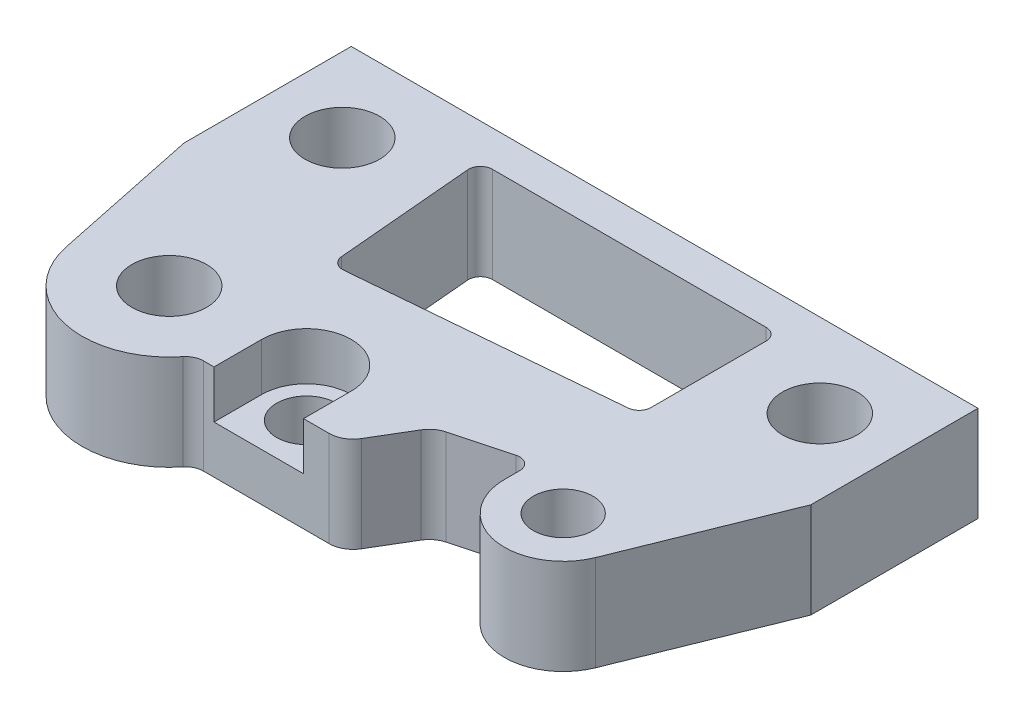
ISO-10303-21;
HEADER;
FILE_DESCRIPTION(('STEP AP214'),'2;1');
FILE_NAME('part.step','',(''),(''),'','','');
FILE_SCHEMA(('AUTOMOTIVE_DESIGN { 1 0 10303 214 1 1 1 1 }'));
ENDSEC;
DATA;
#1=APPLICATION_CONTEXT('core data for automotive mechanical design processes');
#2=APPLICATION_PROTOCOL_DEFINITION('international standard','automotive_design',2000,#1);
#3=PRODUCT_CONTEXT('',#1,'mechanical');
#4=PRODUCT('Part','Part','',(#3));
#5=PRODUCT_RELATED_PRODUCT_CATEGORY('part','',(#4));
#6=PRODUCT_DEFINITION_FORMATION('','',#4);
#7=PRODUCT_DEFINITION_CONTEXT('part definition',#1,'design');
#8=PRODUCT_DEFINITION('design','',#6,#7);
#9=PRODUCT_DEFINITION_SHAPE('','',#8);
#10=(LENGTH_UNIT() NAMED_UNIT(*) SI_UNIT(.MILLI.,.METRE.));
#11=(NAMED_UNIT(*) PLANE_ANGLE_UNIT() SI_UNIT($,.RADIAN.));
#12=(NAMED_UNIT(*) SI_UNIT($,.STERADIAN.) SOLID_ANGLE_UNIT());
#13=UNCERTAINTY_MEASURE_WITH_UNIT(LENGTH_MEASURE(1.E-05),#10,'distance_accuracy_value','');
#14=(GEOMETRIC_REPRESENTATION_CONTEXT(3) GLOBAL_UNCERTAINTY_ASSIGNED_CONTEXT((#13)) GLOBAL_UNIT_ASSIGNED_CONTEXT((#10,
#11,#12)) REPRESENTATION_CONTEXT('',''));
#15=CARTESIAN_POINT('',(0.,0.,0.));
#16=DIRECTION('',(0.,0.,1.));
#17=DIRECTION('',(1.,0.,0.));
#18=AXIS2_PLACEMENT_3D('',#15,#16,#17);
#19=CARTESIAN_POINT('',(14.605,10.16,0.));
#20=DIRECTION('',(0.,-1.,0.));
#21=DIRECTION('',(0.,0.,-1.));
#22=AXIS2_PLACEMENT_3D('',#19,#20,#21);
#23=CYLINDRICAL_SURFACE('',#22,3.175);
#24=DIRECTION('',(0.,-1.,0.));
#25=VECTOR('',#24,1.);
#26=CARTESIAN_POINT('',(15.5135625140549,10.16,-3.04222602021187));
#27=LINE('',#26,#25);
#28=CARTESIAN_POINT('',(15.5135625140549,5.08,-3.04222602021187));
#29=VERTEX_POINT('',#28);
#30=CARTESIAN_POINT('',(15.5135625140549,0.,-3.04222602021187));
#31=VERTEX_POINT('',#30);
#32=EDGE_CURVE('E370',#29,#31,#27,.T.);
#33=ORIENTED_EDGE('',*,*,#32,.F.);
#34=CARTESIAN_POINT('',(14.605,5.08,0.));
#35=DIRECTION('',(0.,1.,0.));
#36=DIRECTION('',(0.,0.,1.));
#37=AXIS2_PLACEMENT_3D('',#34,#35,#36);
#38=CIRCLE('',#37,3.175);
#39=CARTESIAN_POINT('',(17.7745040232334,5.08,0.186733089481817));
#40=VERTEX_POINT('',#39);
#41=EDGE_CURVE('E64',#29,#40,#38,.T.);
#42=ORIENTED_EDGE('',*,*,#41,.T.);
#43=DIRECTION('',(0.,-1.,0.));
#44=VECTOR('',#43,1.);
#45=CARTESIAN_POINT('',(17.7745040232334,10.16,0.186733089481817));
#46=LINE('',#45,#44);
#47=CARTESIAN_POINT('',(17.7745040232334,0.,0.186733089481817));
#48=VERTEX_POINT('',#47);
#49=EDGE_CURVE('E373',#40,#48,#46,.T.);
#50=ORIENTED_EDGE('',*,*,#49,.T.);
#51=CARTESIAN_POINT('',(14.605,0.,0.));
#52=DIRECTION('',(0.,1.,0.));
#53=DIRECTION('',(0.,0.,1.));
#54=AXIS2_PLACEMENT_3D('',#51,#52,#53);
#55=CIRCLE('',#54,3.175);
#56=EDGE_CURVE('E362',#31,#48,#55,.T.);
#57=ORIENTED_EDGE('',*,*,#56,.F.);
#58=EDGE_LOOP('',(#33,#42,#50,#57));
#59=FACE_BOUND('',#58,.T.);
#60=ADVANCED_FACE('F41',(#59),#23,.F.);
#61=CARTESIAN_POINT('',(17.7745040232334,10.16,0.186733089481817));
#62=DIRECTION('',(-0.819152044288991,0.,0.573576436351047));
#63=DIRECTION('',(0.573576436351047,0.,0.819152044288991));
#64=AXIS2_PLACEMENT_3D('',#61,#62,#63);
#65=PLANE('',#64);
#66=ORIENTED_EDGE('',*,*,#49,.F.);
#67=DIRECTION('',(-0.573576436351047,0.,-0.819152044288991));
#68=VECTOR('',#67,1.);
#69=CARTESIAN_POINT('',(17.7745040232334,5.08,0.186733089481817));
#70=LINE('',#69,#68);
#71=EDGE_CURVE('E11',#40,#29,#70,.T.);
#72=ORIENTED_EDGE('',*,*,#71,.T.);
#73=ORIENTED_EDGE('',*,*,#32,.T.);
#74=DIRECTION('',(-0.573576436351047,0.,-0.819152044288991));
#75=VECTOR('',#74,1.);
#76=CARTESIAN_POINT('',(17.7745040232334,0.,0.186733089481817));
#77=LINE('',#76,#75);
#78=EDGE_CURVE('E366',#48,#31,#77,.T.);
#79=ORIENTED_EDGE('',*,*,#78,.F.);
#80=EDGE_LOOP('',(#66,#72,#73,#79));
#81=FACE_BOUND('',#80,.T.);
#82=ADVANCED_FACE('F648',(#81),#65,.T.);
#83=CARTESIAN_POINT('',(41.91,10.16,0.));
#84=DIRECTION('',(0.,-1.,0.));
#85=DIRECTION('',(0.,0.,-1.));
#86=AXIS2_PLACEMENT_3D('',#83,#84,#85);
#87=PLANE('',#86);
#88=CARTESIAN_POINT('',(14.605,10.16,0.));
#89=DIRECTION('',(0.,1.,0.));
#90=DIRECTION('',(0.,0.,1.));
#91=AXIS2_PLACEMENT_3D('',#88,#89,#90);
#92=CIRCLE('',#91,4.7625);
#93=CARTESIAN_POINT('',(19.3675,10.16,0.));
#94=VERTEX_POINT('',#93);
#95=CARTESIAN_POINT('',(9.8425,10.16,0.));
#96=VERTEX_POINT('',#95);
#97=EDGE_CURVE('E238',#94,#96,#92,.T.);
#98=ORIENTED_EDGE('',*,*,#97,.F.);
#99=DIRECTION('',(0.,0.,-1.));
#100=VECTOR('',#99,1.);
#101=CARTESIAN_POINT('',(19.3675,10.16,0.));
#102=LINE('',#101,#100);
#103=CARTESIAN_POINT('',(19.3675,10.16,5.08));
#104=VERTEX_POINT('',#103);
#105=EDGE_CURVE('E254',#104,#94,#102,.T.);
#106=ORIENTED_EDGE('',*,*,#105,.F.);
#107=DIRECTION('',(1.,0.,0.));
#108=VECTOR('',#107,1.);
#109=CARTESIAN_POINT('',(8.72426220376256,10.16,5.08));
#110=LINE('',#109,#108);
#111=CARTESIAN_POINT('',(22.098,10.16,5.08));
#112=VERTEX_POINT('',#111);
#113=EDGE_CURVE('E435',#104,#112,#110,.T.);
#114=ORIENTED_EDGE('',*,*,#113,.T.);
#115=CARTESIAN_POINT('',(22.098,10.16,2.54));
#116=DIRECTION('',(0.,1.,0.));
#117=DIRECTION('',(0.,0.,1.));
#118=AXIS2_PLACEMENT_3D('',#115,#116,#117);
#119=CIRCLE('',#118,2.54);
#120=CARTESIAN_POINT('',(24.279366546391,10.16,3.84124555341646));
#121=VERTEX_POINT('',#120);
#122=EDGE_CURVE('E440',#112,#121,#119,.T.);
#123=ORIENTED_EDGE('',*,*,#122,.T.);
#124=DIRECTION('',(0.512301398982855,0.,-0.858805726925601));
#125=VECTOR('',#124,1.);
#126=CARTESIAN_POINT('',(26.647633453609,10.16,-0.12884156101521));
#127=LINE('',#126,#125);
#128=CARTESIAN_POINT('',(26.647633453609,10.16,-0.128841561015209));
#129=VERTEX_POINT('',#128);
#130=EDGE_CURVE('E443',#121,#129,#127,.T.);
#131=ORIENTED_EDGE('',*,*,#130,.T.);
#132=CARTESIAN_POINT('',(28.829,10.16,1.17240399240126));
#133=DIRECTION('',(0.,-1.,0.));
#134=DIRECTION('',(0.,0.,-1.));
#135=AXIS2_PLACEMENT_3D('',#132,#133,#134);
#136=CIRCLE('',#135,2.54);
#137=CARTESIAN_POINT('',(28.1745172141613,10.16,-1.28182751319085));
#138=VERTEX_POINT('',#137);
#139=EDGE_CURVE('E446',#129,#138,#136,.T.);
#140=ORIENTED_EDGE('',*,*,#139,.T.);
#141=DIRECTION('',(0.966232876217364,0.,-0.257670388125452));
#142=VECTOR('',#141,1.);
#143=CARTESIAN_POINT('',(34.0651586379278,10.16,-2.85271575279605));
#144=LINE('',#143,#142);
#145=CARTESIAN_POINT('',(34.0651586379278,10.16,-2.85271575279604));
#146=VERTEX_POINT('',#145);
#147=EDGE_CURVE('E449',#138,#146,#144,.T.);
#148=ORIENTED_EDGE('',*,*,#147,.T.);
#149=CARTESIAN_POINT('',(34.3924000308471,10.16,-1.62559999999997));
#150=DIRECTION('',(0.,-1.,0.));
#151=DIRECTION('',(0.,0.,-1.));
#152=AXIS2_PLACEMENT_3D('',#149,#150,#151);
#153=CIRCLE('',#152,1.27000000000001);
#154=CARTESIAN_POINT('',(35.6624000308471,10.16,-1.62559999999997));
#155=VERTEX_POINT('',#154);
#156=EDGE_CURVE('E452',#146,#155,#153,.T.);
#157=ORIENTED_EDGE('',*,*,#156,.T.);
#158=DIRECTION('',(0.,0.,1.));
#159=VECTOR('',#158,1.);
#160=CARTESIAN_POINT('',(35.6624000308471,10.16,0.));
#161=LINE('',#160,#159);
#162=CARTESIAN_POINT('',(35.6624000308471,10.16,0.));
#163=VERTEX_POINT('',#162);
#164=EDGE_CURVE('E455',#155,#163,#161,.T.);
#165=ORIENTED_EDGE('',*,*,#164,.T.);
#166=CARTESIAN_POINT('',(41.91,10.16,0.));
#167=DIRECTION('',(0.,1.,0.));
#168=DIRECTION('',(0.,0.,-1.));
#169=AXIS2_PLACEMENT_3D('',#166,#167,#168);
#170=CIRCLE('',#169,6.24759996915287);
#171=CARTESIAN_POINT('',(47.7026738211905,10.16,2.34039214146974));
#172=VERTEX_POINT('',#171);
#173=EDGE_CURVE('E409',#163,#172,#170,.T.);
#174=ORIENTED_EDGE('',*,*,#173,.T.);
#175=DIRECTION('',(0.374606593415917,0.,-0.927183854566786));
#176=VECTOR('',#175,1.);
#177=CARTESIAN_POINT('',(54.2925,10.16,-13.97));
#178=LINE('',#177,#176);
#179=CARTESIAN_POINT('',(54.2925,10.16,-13.97));
#180=VERTEX_POINT('',#179);
#181=EDGE_CURVE('E413',#172,#180,#178,.T.);
#182=ORIENTED_EDGE('',*,*,#181,.T.);
#183=DIRECTION('',(0.,0.,-1.));
#184=VECTOR('',#183,1.);
#185=CARTESIAN_POINT('',(54.2925,10.16,-13.97));
#186=LINE('',#185,#184);
#187=CARTESIAN_POINT('',(54.2925,10.16,-31.75));
#188=VERTEX_POINT('',#187);
#189=EDGE_CURVE('E417',#180,#188,#186,.T.);
#190=ORIENTED_EDGE('',*,*,#189,.T.);
#191=DIRECTION('',(-1.,0.,0.));
#192=VECTOR('',#191,1.);
#193=CARTESIAN_POINT('',(54.2925,10.16,-31.75));
#194=LINE('',#193,#192);
#195=CARTESIAN_POINT('',(-12.3825,10.16,-31.75));
#196=VERTEX_POINT('',#195);
#197=EDGE_CURVE('E420',#188,#196,#194,.T.);
#198=ORIENTED_EDGE('',*,*,#197,.T.);
#199=DIRECTION('',(0.,0.,1.));
#200=VECTOR('',#199,1.);
#201=CARTESIAN_POINT('',(-12.3825,10.16,-31.75));
#202=LINE('',#201,#200);
#203=CARTESIAN_POINT('',(-12.3825,10.16,-13.97));
#204=VERTEX_POINT('',#203);
#205=EDGE_CURVE('E423',#196,#204,#202,.T.);
#206=ORIENTED_EDGE('',*,*,#205,.T.);
#207=DIRECTION('',(0.204074136896406,0.,0.978955436498509));
#208=VECTOR('',#207,1.);
#209=CARTESIAN_POINT('',(-9.07589585177768,10.16,1.89197132316658));
#210=LINE('',#209,#208);
#211=CARTESIAN_POINT('',(-9.07589585177768,10.16,1.89197132316658));
#212=VERTEX_POINT('',#211);
#213=EDGE_CURVE('E426',#204,#212,#210,.T.);
#214=ORIENTED_EDGE('',*,*,#213,.T.);
#215=CARTESIAN_POINT('',(0.,10.16,0.));
#216=DIRECTION('',(0.,1.,0.));
#217=DIRECTION('',(0.,0.,-1.));
#218=AXIS2_PLACEMENT_3D('',#215,#216,#217);
#219=CIRCLE('',#218,9.271);
#220=CARTESIAN_POINT('',(7.23717205539394,10.16,5.794375));
#221=VERTEX_POINT('',#220);
#222=EDGE_CURVE('E429',#212,#221,#219,.T.);
#223=ORIENTED_EDGE('',*,*,#222,.T.);
#224=CARTESIAN_POINT('',(8.72426220376256,10.16,6.985));
#225=DIRECTION('',(0.,-1.,0.));
#226=DIRECTION('',(0.,0.,-1.));
#227=AXIS2_PLACEMENT_3D('',#224,#225,#226);
#228=CIRCLE('',#227,1.905);
#229=CARTESIAN_POINT('',(8.72426220376256,10.16,5.08));
#230=VERTEX_POINT('',#229);
#231=EDGE_CURVE('E432',#221,#230,#228,.T.);
#232=ORIENTED_EDGE('',*,*,#231,.T.);
#233=CARTESIAN_POINT('',(9.8425,10.16,5.08));
#234=VERTEX_POINT('',#233);
#235=EDGE_CURVE('E436',#230,#234,#110,.T.);
#236=ORIENTED_EDGE('',*,*,#235,.T.);
#237=DIRECTION('',(0.,0.,1.));
#238=VECTOR('',#237,1.);
#239=CARTESIAN_POINT('',(9.8425,10.16,5.08));
#240=LINE('',#239,#238);
#241=EDGE_CURVE('E258',#96,#234,#240,.T.);
#242=ORIENTED_EDGE('',*,*,#241,.F.);
#243=EDGE_LOOP('',(#98,#106,#114,#123,#131,#140,#148,#157,#165,#174,#182,#190,#198,#206,#214,
#223,#232,#236,#242));
#244=FACE_BOUND('',#243,.T.);
#245=CARTESIAN_POINT('',(0.,10.16,0.));
#246=DIRECTION('',(0.,1.,0.));
#247=DIRECTION('',(0.,0.,1.));
#248=AXIS2_PLACEMENT_3D('',#245,#246,#247);
#249=CIRCLE('',#248,3.96875);
#250=CARTESIAN_POINT('',(0.,10.16,3.96875));
#251=VERTEX_POINT('',#250);
#252=EDGE_CURVE('E401',#251,#251,#249,.T.);
#253=ORIENTED_EDGE('',*,*,#252,.F.);
#254=EDGE_LOOP('',(#253));
#255=FACE_BOUND('',#254,.T.);
#256=CARTESIAN_POINT('',(-4.445,10.16,-22.86));
#257=DIRECTION('',(0.,1.,0.));
#258=DIRECTION('',(0.,0.,1.));
#259=AXIS2_PLACEMENT_3D('',#256,#257,#258);
#260=CIRCLE('',#259,3.96875);
#261=CARTESIAN_POINT('',(-4.445,10.16,-18.89125));
#262=VERTEX_POINT('',#261);
#263=EDGE_CURVE('E393',#262,#262,#260,.T.);
#264=ORIENTED_EDGE('',*,*,#263,.F.);
#265=EDGE_LOOP('',(#264));
#266=FACE_BOUND('',#265,.T.);
#267=CARTESIAN_POINT('',(46.355,10.16,-22.86));
#268=DIRECTION('',(0.,1.,0.));
#269=DIRECTION('',(0.,0.,1.));
#270=AXIS2_PLACEMENT_3D('',#267,#268,#269);
#271=CIRCLE('',#270,3.96875);
#272=CARTESIAN_POINT('',(46.355,10.16,-18.89125));
#273=VERTEX_POINT('',#272);
#274=EDGE_CURVE('E385',#273,#273,#271,.T.);
#275=ORIENTED_EDGE('',*,*,#274,.F.);
#276=EDGE_LOOP('',(#275));
#277=FACE_BOUND('',#276,.T.);
#278=CARTESIAN_POINT('',(41.91,10.16,0.));
#279=DIRECTION('',(0.,1.,0.));
#280=DIRECTION('',(0.,0.,1.));
#281=AXIS2_PLACEMENT_3D('',#278,#279,#280);
#282=CIRCLE('',#281,3.175);
#283=CARTESIAN_POINT('',(41.91,10.16,3.175));
#284=VERTEX_POINT('',#283);
#285=EDGE_CURVE('E377',#284,#284,#282,.T.);
#286=ORIENTED_EDGE('',*,*,#285,.F.);
#287=EDGE_LOOP('',(#286));
#288=FACE_BOUND('',#287,.T.);
#289=CARTESIAN_POINT('',(7.72632013531664,10.16,-11.9940597077124));
#290=DIRECTION('',(0.,1.,0.));
#291=DIRECTION('',(0.,0.,1.));
#292=AXIS2_PLACEMENT_3D('',#289,#290,#291);
#293=CIRCLE('',#292,1.27);
#294=CARTESIAN_POINT('',(6.46115286874012,10.16,-11.8833719144229));
#295=VERTEX_POINT('',#294);
#296=CARTESIAN_POINT('',(7.83700792860617,10.16,-10.7288924411359));
#297=VERTEX_POINT('',#296);
#298=EDGE_CURVE('E280',#295,#297,#293,.T.);
#299=ORIENTED_EDGE('',*,*,#298,.F.);
#300=DIRECTION('',(0.087155742747662,0.,0.996194698091745));
#301=VECTOR('',#300,1.);
#302=CARTESIAN_POINT('',(5.17717446658157,10.16,-26.5593122067105));
#303=LINE('',#302,#301);
#304=CARTESIAN_POINT('',(5.17717446658156,10.16,-26.5593122067105));
#305=VERTEX_POINT('',#304);
#306=EDGE_CURVE('E303',#305,#295,#303,.T.);
#307=ORIENTED_EDGE('',*,*,#306,.F.);
#308=CARTESIAN_POINT('',(6.44234173315808,10.16,-26.67));
#309=DIRECTION('',(0.,1.,0.));
#310=DIRECTION('',(0.,0.,-1.));
#311=AXIS2_PLACEMENT_3D('',#308,#309,#310);
#312=CIRCLE('',#311,1.27);
#313=CARTESIAN_POINT('',(6.44234173315808,10.16,-27.94));
#314=VERTEX_POINT('',#313);
#315=EDGE_CURVE('E299',#314,#305,#312,.T.);
#316=ORIENTED_EDGE('',*,*,#315,.F.);
#317=DIRECTION('',(-1.,0.,0.));
#318=VECTOR('',#317,1.);
#319=CARTESIAN_POINT('',(35.56,10.16,-27.94));
#320=LINE('',#319,#318);
#321=CARTESIAN_POINT('',(35.56,10.16,-27.94));
#322=VERTEX_POINT('',#321);
#323=EDGE_CURVE('E296',#322,#314,#320,.T.);
#324=ORIENTED_EDGE('',*,*,#323,.F.);
#325=CARTESIAN_POINT('',(35.56,10.16,-26.67));
#326=DIRECTION('',(0.,1.,0.));
#327=DIRECTION('',(0.,0.,-1.));
#328=AXIS2_PLACEMENT_3D('',#325,#326,#327);
#329=CIRCLE('',#328,1.27);
#330=CARTESIAN_POINT('',(36.83,10.16,-26.67));
#331=VERTEX_POINT('',#330);
#332=EDGE_CURVE('E293',#331,#322,#329,.T.);
#333=ORIENTED_EDGE('',*,*,#332,.F.);
#334=DIRECTION('',(0.,0.,-1.));
#335=VECTOR('',#334,1.);
#336=CARTESIAN_POINT('',(36.83,10.16,-14.4291911600822));
#337=LINE('',#336,#335);
#338=CARTESIAN_POINT('',(36.83,10.16,-14.4291911600822));
#339=VERTEX_POINT('',#338);
#340=EDGE_CURVE('E290',#339,#331,#337,.T.);
#341=ORIENTED_EDGE('',*,*,#340,.F.);
#342=CARTESIAN_POINT('',(35.56,10.16,-14.4291911600822));
#343=DIRECTION('',(0.,1.,0.));
#344=DIRECTION('',(0.,0.,1.));
#345=AXIS2_PLACEMENT_3D('',#342,#343,#344);
#346=CIRCLE('',#345,1.27);
#347=CARTESIAN_POINT('',(35.6706877932895,10.16,-13.1640238935057));
#348=VERTEX_POINT('',#347);
#349=EDGE_CURVE('E287',#348,#339,#346,.T.);
#350=ORIENTED_EDGE('',*,*,#349,.F.);
#351=DIRECTION('',(0.996194698091745,0.,-0.0871557427476655));
#352=VECTOR('',#351,1.);
#353=CARTESIAN_POINT('',(7.83700792860617,10.16,-10.7288924411359));
#354=LINE('',#353,#352);
#355=EDGE_CURVE('E283',#297,#348,#354,.T.);
#356=ORIENTED_EDGE('',*,*,#355,.F.);
#357=EDGE_LOOP('',(#299,#307,#316,#324,#333,#341,#350,#356));
#358=FACE_BOUND('',#357,.T.);
#359=ADVANCED_FACE('F585',(#244,#255,#266,#277,#288,#358),#87,.F.);
#360=CARTESIAN_POINT('',(41.91,0.,0.));
#361=DIRECTION('',(0.,-1.,0.));
#362=DIRECTION('',(0.,0.,-1.));
#363=AXIS2_PLACEMENT_3D('',#360,#361,#362);
#364=PLANE('',#363);
#365=CARTESIAN_POINT('',(46.355,0.,-22.86));
#366=DIRECTION('',(0.,1.,0.));
#367=DIRECTION('',(0.,0.,1.));
#368=AXIS2_PLACEMENT_3D('',#365,#366,#367);
#369=CIRCLE('',#368,3.96875);
#370=CARTESIAN_POINT('',(46.355,0.,-18.89125));
#371=VERTEX_POINT('',#370);
#372=EDGE_CURVE('E381',#371,#371,#369,.T.);
#373=ORIENTED_EDGE('',*,*,#372,.T.);
#374=EDGE_LOOP('',(#373));
#375=FACE_BOUND('',#374,.T.);
#376=CARTESIAN_POINT('',(0.,0.,0.));
#377=DIRECTION('',(0.,1.,0.));
#378=DIRECTION('',(0.,0.,1.));
#379=AXIS2_PLACEMENT_3D('',#376,#377,#378);
#380=CIRCLE('',#379,3.96875);
#381=CARTESIAN_POINT('',(0.,0.,3.96875));
#382=VERTEX_POINT('',#381);
#383=EDGE_CURVE('E397',#382,#382,#380,.T.);
#384=ORIENTED_EDGE('',*,*,#383,.T.);
#385=EDGE_LOOP('',(#384));
#386=FACE_BOUND('',#385,.T.);
#387=CARTESIAN_POINT('',(41.91,0.,0.));
#388=DIRECTION('',(0.,1.,0.));
#389=DIRECTION('',(0.,0.,-1.));
#390=AXIS2_PLACEMENT_3D('',#387,#388,#389);
#391=CIRCLE('',#390,6.24759996915287);
#392=CARTESIAN_POINT('',(35.6624000308471,0.,0.));
#393=VERTEX_POINT('',#392);
#394=CARTESIAN_POINT('',(47.7026738211905,0.,2.34039214146974));
#395=VERTEX_POINT('',#394);
#396=EDGE_CURVE('E405',#393,#395,#391,.T.);
#397=ORIENTED_EDGE('',*,*,#396,.F.);
#398=DIRECTION('',(0.,0.,1.));
#399=VECTOR('',#398,1.);
#400=CARTESIAN_POINT('',(35.6624000308471,0.,0.));
#401=LINE('',#400,#399);
#402=CARTESIAN_POINT('',(35.6624000308471,0.,-1.62559999999997));
#403=VERTEX_POINT('',#402);
#404=EDGE_CURVE('E414',#403,#393,#401,.T.);
#405=ORIENTED_EDGE('',*,*,#404,.F.);
#406=CARTESIAN_POINT('',(34.3924000308471,0.,-1.62559999999997));
#407=DIRECTION('',(0.,-1.,0.));
#408=DIRECTION('',(0.,0.,-1.));
#409=AXIS2_PLACEMENT_3D('',#406,#407,#408);
#410=CIRCLE('',#409,1.27000000000001);
#411=CARTESIAN_POINT('',(34.0651586379278,0.,-2.85271575279604));
#412=VERTEX_POINT('',#411);
#413=EDGE_CURVE('E498',#412,#403,#410,.T.);
#414=ORIENTED_EDGE('',*,*,#413,.F.);
#415=DIRECTION('',(0.966232876217364,0.,-0.257670388125452));
#416=VECTOR('',#415,1.);
#417=CARTESIAN_POINT('',(34.0651586379278,0.,-2.85271575279605));
#418=LINE('',#417,#416);
#419=CARTESIAN_POINT('',(28.1745172141613,0.,-1.28182751319085));
#420=VERTEX_POINT('',#419);
#421=EDGE_CURVE('E495',#420,#412,#418,.T.);
#422=ORIENTED_EDGE('',*,*,#421,.F.);
#423=CARTESIAN_POINT('',(28.829,0.,1.17240399240126));
#424=DIRECTION('',(0.,-1.,0.));
#425=DIRECTION('',(0.,0.,-1.));
#426=AXIS2_PLACEMENT_3D('',#423,#424,#425);
#427=CIRCLE('',#426,2.54);
#428=CARTESIAN_POINT('',(26.647633453609,0.,-0.128841561015209));
#429=VERTEX_POINT('',#428);
#430=EDGE_CURVE('E492',#429,#420,#427,.T.);
#431=ORIENTED_EDGE('',*,*,#430,.F.);
#432=DIRECTION('',(0.512301398982855,0.,-0.858805726925601));
#433=VECTOR('',#432,1.);
#434=CARTESIAN_POINT('',(26.647633453609,0.,-0.12884156101521));
#435=LINE('',#434,#433);
#436=CARTESIAN_POINT('',(24.279366546391,0.,3.84124555341646));
#437=VERTEX_POINT('',#436);
#438=EDGE_CURVE('E489',#437,#429,#435,.T.);
#439=ORIENTED_EDGE('',*,*,#438,.F.);
#440=CARTESIAN_POINT('',(22.098,0.,2.54));
#441=DIRECTION('',(0.,1.,0.));
#442=DIRECTION('',(0.,0.,1.));
#443=AXIS2_PLACEMENT_3D('',#440,#441,#442);
#444=CIRCLE('',#443,2.54);
#445=CARTESIAN_POINT('',(22.098,0.,5.08));
#446=VERTEX_POINT('',#445);
#447=EDGE_CURVE('E486',#446,#437,#444,.T.);
#448=ORIENTED_EDGE('',*,*,#447,.F.);
#449=DIRECTION('',(1.,0.,0.));
#450=VECTOR('',#449,1.);
#451=CARTESIAN_POINT('',(8.72426220376256,0.,5.08));
#452=LINE('',#451,#450);
#453=CARTESIAN_POINT('',(8.72426220376256,0.,5.08));
#454=VERTEX_POINT('',#453);
#455=EDGE_CURVE('E483',#454,#446,#452,.T.);
#456=ORIENTED_EDGE('',*,*,#455,.F.);
#457=CARTESIAN_POINT('',(8.72426220376256,0.,6.985));
#458=DIRECTION('',(0.,-1.,0.));
#459=DIRECTION('',(0.,0.,-1.));
#460=AXIS2_PLACEMENT_3D('',#457,#458,#459);
#461=CIRCLE('',#460,1.905);
#462=CARTESIAN_POINT('',(7.23717205539394,0.,5.794375));
#463=VERTEX_POINT('',#462);
#464=EDGE_CURVE('E480',#463,#454,#461,.T.);
#465=ORIENTED_EDGE('',*,*,#464,.F.);
#466=CARTESIAN_POINT('',(0.,0.,0.));
#467=DIRECTION('',(0.,1.,0.));
#468=DIRECTION('',(0.,0.,-1.));
#469=AXIS2_PLACEMENT_3D('',#466,#467,#468);
#470=CIRCLE('',#469,9.271);
#471=CARTESIAN_POINT('',(-9.07589585177768,0.,1.89197132316658));
#472=VERTEX_POINT('',#471);
#473=EDGE_CURVE('E477',#472,#463,#470,.T.);
#474=ORIENTED_EDGE('',*,*,#473,.F.);
#475=DIRECTION('',(0.204074136896406,0.,0.978955436498509));
#476=VECTOR('',#475,1.);
#477=CARTESIAN_POINT('',(-9.07589585177768,0.,1.89197132316658));
#478=LINE('',#477,#476);
#479=CARTESIAN_POINT('',(-12.3825,0.,-13.97));
#480=VERTEX_POINT('',#479);
#481=EDGE_CURVE('E474',#480,#472,#478,.T.);
#482=ORIENTED_EDGE('',*,*,#481,.F.);
#483=DIRECTION('',(0.,0.,1.));
#484=VECTOR('',#483,1.);
#485=CARTESIAN_POINT('',(-12.3825,0.,-31.75));
#486=LINE('',#485,#484);
#487=CARTESIAN_POINT('',(-12.3825,0.,-31.75));
#488=VERTEX_POINT('',#487);
#489=EDGE_CURVE('E471',#488,#480,#486,.T.);
#490=ORIENTED_EDGE('',*,*,#489,.F.);
#491=DIRECTION('',(-1.,0.,0.));
#492=VECTOR('',#491,1.);
#493=CARTESIAN_POINT('',(54.2925,0.,-31.75));
#494=LINE('',#493,#492);
#495=CARTESIAN_POINT('',(54.2925,0.,-31.75));
#496=VERTEX_POINT('',#495);
#497=EDGE_CURVE('E468',#496,#488,#494,.T.);
#498=ORIENTED_EDGE('',*,*,#497,.F.);
#499=DIRECTION('',(0.,0.,-1.));
#500=VECTOR('',#499,1.);
#501=CARTESIAN_POINT('',(54.2925,0.,-13.97));
#502=LINE('',#501,#500);
#503=CARTESIAN_POINT('',(54.2925,0.,-13.97));
#504=VERTEX_POINT('',#503);
#505=EDGE_CURVE('E465',#504,#496,#502,.T.);
#506=ORIENTED_EDGE('',*,*,#505,.F.);
#507=DIRECTION('',(0.374606593415917,0.,-0.927183854566786));
#508=VECTOR('',#507,1.);
#509=CARTESIAN_POINT('',(54.2925,0.,-13.97));
#510=LINE('',#509,#508);
#511=EDGE_CURVE('E462',#395,#504,#510,.T.);
#512=ORIENTED_EDGE('',*,*,#511,.F.);
#513=EDGE_LOOP('',(#397,#405,#414,#422,#431,#439,#448,#456,#465,#474,#482,#490,#498,#506,#512));
#514=FACE_BOUND('',#513,.T.);
#515=CARTESIAN_POINT('',(-4.445,0.,-22.86));
#516=DIRECTION('',(0.,1.,0.));
#517=DIRECTION('',(0.,0.,1.));
#518=AXIS2_PLACEMENT_3D('',#515,#516,#517);
#519=CIRCLE('',#518,3.96875);
#520=CARTESIAN_POINT('',(-4.445,0.,-18.89125));
#521=VERTEX_POINT('',#520);
#522=EDGE_CURVE('E389',#521,#521,#519,.T.);
#523=ORIENTED_EDGE('',*,*,#522,.T.);
#524=EDGE_LOOP('',(#523));
#525=FACE_BOUND('',#524,.T.);
#526=CARTESIAN_POINT('',(41.91,0.,0.));
#527=DIRECTION('',(0.,1.,0.));
#528=DIRECTION('',(0.,0.,1.));
#529=AXIS2_PLACEMENT_3D('',#526,#527,#528);
#530=CIRCLE('',#529,3.175);
#531=CARTESIAN_POINT('',(41.91,0.,3.175));
#532=VERTEX_POINT('',#531);
#533=EDGE_CURVE('E376',#532,#532,#530,.T.);
#534=ORIENTED_EDGE('',*,*,#533,.T.);
#535=EDGE_LOOP('',(#534));
#536=FACE_BOUND('',#535,.T.);
#537=ORIENTED_EDGE('',*,*,#78,.T.);
#538=ORIENTED_EDGE('',*,*,#56,.T.);
#539=EDGE_LOOP('',(#537,#538));
#540=FACE_BOUND('',#539,.T.);
#541=DIRECTION('',(0.087155742747662,0.,0.996194698091745));
#542=VECTOR('',#541,1.);
#543=CARTESIAN_POINT('',(5.17717446658157,0.,-26.5593122067105));
#544=LINE('',#543,#542);
#545=CARTESIAN_POINT('',(5.17717446658157,0.,-26.5593122067105));
#546=VERTEX_POINT('',#545);
#547=CARTESIAN_POINT('',(6.46115286874011,0.,-11.8833719144229));
#548=VERTEX_POINT('',#547);
#549=EDGE_CURVE('E284',#546,#548,#544,.T.);
#550=ORIENTED_EDGE('',*,*,#549,.T.);
#551=CARTESIAN_POINT('',(7.72632013531664,0.,-11.9940597077124));
#552=DIRECTION('',(0.,1.,0.));
#553=DIRECTION('',(0.,0.,1.));
#554=AXIS2_PLACEMENT_3D('',#551,#552,#553);
#555=CIRCLE('',#554,1.27);
#556=CARTESIAN_POINT('',(7.83700792860617,0.,-10.7288924411359));
#557=VERTEX_POINT('',#556);
#558=EDGE_CURVE('E279',#548,#557,#555,.T.);
#559=ORIENTED_EDGE('',*,*,#558,.T.);
#560=DIRECTION('',(0.996194698091745,0.,-0.0871557427476655));
#561=VECTOR('',#560,1.);
#562=CARTESIAN_POINT('',(7.83700792860617,0.,-10.7288924411359));
#563=LINE('',#562,#561);
#564=CARTESIAN_POINT('',(35.6706877932895,0.,-13.1640238935057));
#565=VERTEX_POINT('',#564);
#566=EDGE_CURVE('E310',#557,#565,#563,.T.);
#567=ORIENTED_EDGE('',*,*,#566,.T.);
#568=CARTESIAN_POINT('',(35.56,0.,-14.4291911600822));
#569=DIRECTION('',(0.,1.,0.));
#570=DIRECTION('',(0.,0.,1.));
#571=AXIS2_PLACEMENT_3D('',#568,#569,#570);
#572=CIRCLE('',#571,1.27);
#573=CARTESIAN_POINT('',(36.83,0.,-14.4291911600822));
#574=VERTEX_POINT('',#573);
#575=EDGE_CURVE('E314',#565,#574,#572,.T.);
#576=ORIENTED_EDGE('',*,*,#575,.T.);
#577=DIRECTION('',(0.,0.,-1.));
#578=VECTOR('',#577,1.);
#579=CARTESIAN_POINT('',(36.83,0.,-14.4291911600822));
#580=LINE('',#579,#578);
#581=CARTESIAN_POINT('',(36.83,0.,-26.67));
#582=VERTEX_POINT('',#581);
#583=EDGE_CURVE('E318',#574,#582,#580,.T.);
#584=ORIENTED_EDGE('',*,*,#583,.T.);
#585=CARTESIAN_POINT('',(35.56,0.,-26.67));
#586=DIRECTION('',(0.,1.,0.));
#587=DIRECTION('',(0.,0.,-1.));
#588=AXIS2_PLACEMENT_3D('',#585,#586,#587);
#589=CIRCLE('',#588,1.27);
#590=CARTESIAN_POINT('',(35.56,0.,-27.94));
#591=VERTEX_POINT('',#590);
#592=EDGE_CURVE('E322',#582,#591,#589,.T.);
#593=ORIENTED_EDGE('',*,*,#592,.T.);
#594=DIRECTION('',(-1.,0.,0.));
#595=VECTOR('',#594,1.);
#596=CARTESIAN_POINT('',(35.56,0.,-27.94));
#597=LINE('',#596,#595);
#598=CARTESIAN_POINT('',(6.44234173315808,0.,-27.94));
#599=VERTEX_POINT('',#598);
#600=EDGE_CURVE('E326',#591,#599,#597,.T.);
#601=ORIENTED_EDGE('',*,*,#600,.T.);
#602=CARTESIAN_POINT('',(6.44234173315808,0.,-26.67));
#603=DIRECTION('',(0.,1.,0.));
#604=DIRECTION('',(0.,0.,-1.));
#605=AXIS2_PLACEMENT_3D('',#602,#603,#604);
#606=CIRCLE('',#605,1.27);
#607=EDGE_CURVE('E330',#599,#546,#606,.T.);
#608=ORIENTED_EDGE('',*,*,#607,.T.);
#609=EDGE_LOOP('',(#550,#559,#567,#576,#584,#593,#601,#608));
#610=FACE_BOUND('',#609,.T.);
#611=ADVANCED_FACE('F569',(#375,#386,#514,#525,#536,#540,#610),#364,.T.);
#612=CARTESIAN_POINT('',(41.91,10.16,0.));
#613=DIRECTION('',(0.,-1.,0.));
#614=DIRECTION('',(0.,0.,-1.));
#615=AXIS2_PLACEMENT_3D('',#612,#613,#614);
#616=CYLINDRICAL_SURFACE('',#615,6.24759996915287);
#617=ORIENTED_EDGE('',*,*,#396,.T.);
#618=DIRECTION('',(0.,-1.,0.));
#619=VECTOR('',#618,1.);
#620=CARTESIAN_POINT('',(47.7026738211905,10.16,2.34039214146974));
#621=LINE('',#620,#619);
#622=EDGE_CURVE('E50',#172,#395,#621,.T.);
#623=ORIENTED_EDGE('',*,*,#622,.F.);
#624=ORIENTED_EDGE('',*,*,#173,.F.);
#625=DIRECTION('',(0.,-1.,0.));
#626=VECTOR('',#625,1.);
#627=CARTESIAN_POINT('',(35.6624000308471,10.16,0.));
#628=LINE('',#627,#626);
#629=EDGE_CURVE('E458',#163,#393,#628,.T.);
#630=ORIENTED_EDGE('',*,*,#629,.T.);
#631=EDGE_LOOP('',(#617,#623,#624,#630));
#632=FACE_BOUND('',#631,.T.);
#633=ADVANCED_FACE('F43',(#632),#616,.T.);
#634=CARTESIAN_POINT('',(54.2925,10.16,-13.97));
#635=DIRECTION('',(-0.927183854566786,0.,-0.374606593415917));
#636=DIRECTION('',(-0.374606593415917,0.,0.927183854566786));
#637=AXIS2_PLACEMENT_3D('',#634,#635,#636);
#638=PLANE('',#637);
#639=ORIENTED_EDGE('',*,*,#511,.T.);
#640=DIRECTION('',(0.,-1.,0.));
#641=VECTOR('',#640,1.);
#642=CARTESIAN_POINT('',(54.2925,10.16,-13.97));
#643=LINE('',#642,#641);
#644=EDGE_CURVE('E554',#180,#504,#643,.T.);
#645=ORIENTED_EDGE('',*,*,#644,.F.);
#646=ORIENTED_EDGE('',*,*,#181,.F.);
#647=ORIENTED_EDGE('',*,*,#622,.T.);
#648=EDGE_LOOP('',(#639,#645,#646,#647));
#649=FACE_BOUND('',#648,.T.);
#650=ADVANCED_FACE('F561',(#649),#638,.F.);
#651=CARTESIAN_POINT('',(54.2925,10.16,-13.97));
#652=DIRECTION('',(-1.,0.,0.));
#653=DIRECTION('',(0.,0.,1.));
#654=AXIS2_PLACEMENT_3D('',#651,#652,#653);
#655=PLANE('',#654);
#656=ORIENTED_EDGE('',*,*,#505,.T.);
#657=DIRECTION('',(0.,-1.,0.));
#658=VECTOR('',#657,1.);
#659=CARTESIAN_POINT('',(54.2925,10.16,-31.75));
#660=LINE('',#659,#658);
#661=EDGE_CURVE('E550',#188,#496,#660,.T.);
#662=ORIENTED_EDGE('',*,*,#661,.F.);
#663=ORIENTED_EDGE('',*,*,#189,.F.);
#664=ORIENTED_EDGE('',*,*,#644,.T.);
#665=EDGE_LOOP('',(#656,#662,#663,#664));
#666=FACE_BOUND('',#665,.T.);
#667=ADVANCED_FACE('F577',(#666),#655,.F.);
#668=CARTESIAN_POINT('',(54.2925,10.16,-31.75));
#669=DIRECTION('',(0.,0.,1.));
#670=DIRECTION('',(1.,0.,0.));
#671=AXIS2_PLACEMENT_3D('',#668,#669,#670);
#672=PLANE('',#671);
#673=ORIENTED_EDGE('',*,*,#497,.T.);
#674=DIRECTION('',(0.,-1.,0.));
#675=VECTOR('',#674,1.);
#676=CARTESIAN_POINT('',(-12.3825,10.16,-31.75));
#677=LINE('',#676,#675);
#678=EDGE_CURVE('E546',#196,#488,#677,.T.);
#679=ORIENTED_EDGE('',*,*,#678,.F.);
#680=ORIENTED_EDGE('',*,*,#197,.F.);
#681=ORIENTED_EDGE('',*,*,#661,.T.);
#682=EDGE_LOOP('',(#673,#679,#680,#681));
#683=FACE_BOUND('',#682,.T.);
#684=ADVANCED_FACE('F581',(#683),#672,.F.);
#685=CARTESIAN_POINT('',(-12.3825,10.16,-31.75));
#686=DIRECTION('',(1.,0.,0.));
#687=DIRECTION('',(0.,0.,-1.));
#688=AXIS2_PLACEMENT_3D('',#685,#686,#687);
#689=PLANE('',#688);
#690=ORIENTED_EDGE('',*,*,#489,.T.);
#691=DIRECTION('',(0.,-1.,0.));
#692=VECTOR('',#691,1.);
#693=CARTESIAN_POINT('',(-12.3825,10.16,-13.97));
#694=LINE('',#693,#692);
#695=EDGE_CURVE('E542',#204,#480,#694,.T.);
#696=ORIENTED_EDGE('',*,*,#695,.F.);
#697=ORIENTED_EDGE('',*,*,#205,.F.);
#698=ORIENTED_EDGE('',*,*,#678,.T.);
#699=EDGE_LOOP('',(#690,#696,#697,#698));
#700=FACE_BOUND('',#699,.T.);
#701=ADVANCED_FACE('F638',(#700),#689,.F.);
#702=CARTESIAN_POINT('',(-9.07589585177768,10.16,1.89197132316658));
#703=DIRECTION('',(0.978955436498509,0.,-0.204074136896406));
#704=DIRECTION('',(-0.204074136896406,0.,-0.97895543649851));
#705=AXIS2_PLACEMENT_3D('',#702,#703,#704);
#706=PLANE('',#705);
#707=ORIENTED_EDGE('',*,*,#481,.T.);
#708=DIRECTION('',(0.,-1.,0.));
#709=VECTOR('',#708,1.);
#710=CARTESIAN_POINT('',(-9.07589585177768,10.16,1.89197132316658));
#711=LINE('',#710,#709);
#712=EDGE_CURVE('E538',#212,#472,#711,.T.);
#713=ORIENTED_EDGE('',*,*,#712,.F.);
#714=ORIENTED_EDGE('',*,*,#213,.F.);
#715=ORIENTED_EDGE('',*,*,#695,.T.);
#716=EDGE_LOOP('',(#707,#713,#714,#715));
#717=FACE_BOUND('',#716,.T.);
#718=ADVANCED_FACE('F636',(#717),#706,.F.);
#719=CARTESIAN_POINT('',(0.,10.16,0.));
#720=DIRECTION('',(0.,-1.,0.));
#721=DIRECTION('',(0.,0.,-1.));
#722=AXIS2_PLACEMENT_3D('',#719,#720,#721);
#723=CYLINDRICAL_SURFACE('',#722,9.271);
#724=ORIENTED_EDGE('',*,*,#473,.T.);
#725=DIRECTION('',(0.,-1.,0.));
#726=VECTOR('',#725,1.);
#727=CARTESIAN_POINT('',(7.23717205539394,10.16,5.794375));
#728=LINE('',#727,#726);
#729=EDGE_CURVE('E534',#221,#463,#728,.T.);
#730=ORIENTED_EDGE('',*,*,#729,.F.);
#731=ORIENTED_EDGE('',*,*,#222,.F.);
#732=ORIENTED_EDGE('',*,*,#712,.T.);
#733=EDGE_LOOP('',(#724,#730,#731,#732));
#734=FACE_BOUND('',#733,.T.);
#735=ADVANCED_FACE('F631',(#734),#723,.T.);
#736=CARTESIAN_POINT('',(8.72426220376256,10.16,6.985));
#737=DIRECTION('',(0.,-1.,0.));
#738=DIRECTION('',(0.,0.,-1.));
#739=AXIS2_PLACEMENT_3D('',#736,#737,#738);
#740=CYLINDRICAL_SURFACE('',#739,1.905);
#741=ORIENTED_EDGE('',*,*,#464,.T.);
#742=DIRECTION('',(0.,-1.,0.));
#743=VECTOR('',#742,1.);
#744=CARTESIAN_POINT('',(8.72426220376256,10.16,5.08));
#745=LINE('',#744,#743);
#746=EDGE_CURVE('E530',#230,#454,#745,.T.);
#747=ORIENTED_EDGE('',*,*,#746,.F.);
#748=ORIENTED_EDGE('',*,*,#231,.F.);
#749=ORIENTED_EDGE('',*,*,#729,.T.);
#750=EDGE_LOOP('',(#741,#747,#748,#749));
#751=FACE_BOUND('',#750,.T.);
#752=ADVANCED_FACE('F626',(#751),#740,.F.);
#753=CARTESIAN_POINT('',(8.72426220376256,10.16,5.08));
#754=DIRECTION('',(0.,0.,-1.));
#755=DIRECTION('',(-1.,0.,0.));
#756=AXIS2_PLACEMENT_3D('',#753,#754,#755);
#757=PLANE('',#756);
#758=ORIENTED_EDGE('',*,*,#113,.F.);
#759=DIRECTION('',(0.,1.,0.));
#760=VECTOR('',#759,1.);
#761=CARTESIAN_POINT('',(19.3675,5.08,5.08));
#762=LINE('',#761,#760);
#763=CARTESIAN_POINT('',(19.3675,5.08,5.08));
#764=VERTEX_POINT('',#763);
#765=EDGE_CURVE('E272',#764,#104,#762,.T.);
#766=ORIENTED_EDGE('',*,*,#765,.F.);
#767=DIRECTION('',(1.,0.,0.));
#768=VECTOR('',#767,1.);
#769=CARTESIAN_POINT('',(19.3675,5.08,5.08));
#770=LINE('',#769,#768);
#771=CARTESIAN_POINT('',(9.8425,5.08,5.08));
#772=VERTEX_POINT('',#771);
#773=EDGE_CURVE('E249',#772,#764,#770,.T.);
#774=ORIENTED_EDGE('',*,*,#773,.F.);
#775=DIRECTION('',(0.,1.,0.));
#776=VECTOR('',#775,1.);
#777=CARTESIAN_POINT('',(9.8425,5.08,5.08));
#778=LINE('',#777,#776);
#779=EDGE_CURVE('E242',#772,#234,#778,.T.);
#780=ORIENTED_EDGE('',*,*,#779,.T.);
#781=ORIENTED_EDGE('',*,*,#235,.F.);
#782=ORIENTED_EDGE('',*,*,#746,.T.);
#783=ORIENTED_EDGE('',*,*,#455,.T.);
#784=DIRECTION('',(0.,-1.,0.));
#785=VECTOR('',#784,1.);
#786=CARTESIAN_POINT('',(22.098,10.16,5.08));
#787=LINE('',#786,#785);
#788=EDGE_CURVE('E526',#112,#446,#787,.T.);
#789=ORIENTED_EDGE('',*,*,#788,.F.);
#790=EDGE_LOOP('',(#758,#766,#774,#780,#781,#782,#783,#789));
#791=FACE_BOUND('',#790,.T.);
#792=ADVANCED_FACE('F620',(#791),#757,.F.);
#793=CARTESIAN_POINT('',(22.098,10.16,2.54));
#794=DIRECTION('',(0.,-1.,0.));
#795=DIRECTION('',(0.,0.,-1.));
#796=AXIS2_PLACEMENT_3D('',#793,#794,#795);
#797=CYLINDRICAL_SURFACE('',#796,2.54);
#798=ORIENTED_EDGE('',*,*,#447,.T.);
#799=DIRECTION('',(0.,-1.,0.));
#800=VECTOR('',#799,1.);
#801=CARTESIAN_POINT('',(24.279366546391,10.16,3.84124555341646));
#802=LINE('',#801,#800);
#803=EDGE_CURVE('E522',#121,#437,#802,.T.);
#804=ORIENTED_EDGE('',*,*,#803,.F.);
#805=ORIENTED_EDGE('',*,*,#122,.F.);
#806=ORIENTED_EDGE('',*,*,#788,.T.);
#807=EDGE_LOOP('',(#798,#804,#805,#806));
#808=FACE_BOUND('',#807,.T.);
#809=ADVANCED_FACE('F615',(#808),#797,.T.);
#810=CARTESIAN_POINT('',(26.647633453609,10.16,-0.12884156101521));
#811=DIRECTION('',(-0.8588057269256,0.,-0.512301398982855));
#812=DIRECTION('',(-0.512301398982855,0.,0.858805726925601));
#813=AXIS2_PLACEMENT_3D('',#810,#811,#812);
#814=PLANE('',#813);
#815=ORIENTED_EDGE('',*,*,#438,.T.);
#816=DIRECTION('',(0.,-1.,0.));
#817=VECTOR('',#816,1.);
#818=CARTESIAN_POINT('',(26.647633453609,10.16,-0.128841561015209));
#819=LINE('',#818,#817);
#820=EDGE_CURVE('E518',#129,#429,#819,.T.);
#821=ORIENTED_EDGE('',*,*,#820,.F.);
#822=ORIENTED_EDGE('',*,*,#130,.F.);
#823=ORIENTED_EDGE('',*,*,#803,.T.);
#824=EDGE_LOOP('',(#815,#821,#822,#823));
#825=FACE_BOUND('',#824,.T.);
#826=ADVANCED_FACE('F609',(#825),#814,.F.);
#827=CARTESIAN_POINT('',(28.829,10.16,1.17240399240126));
#828=DIRECTION('',(0.,-1.,0.));
#829=DIRECTION('',(0.,0.,-1.));
#830=AXIS2_PLACEMENT_3D('',#827,#828,#829);
#831=CYLINDRICAL_SURFACE('',#830,2.54);
#832=ORIENTED_EDGE('',*,*,#430,.T.);
#833=DIRECTION('',(0.,-1.,0.));
#834=VECTOR('',#833,1.);
#835=CARTESIAN_POINT('',(28.1745172141613,10.16,-1.28182751319085));
#836=LINE('',#835,#834);
#837=EDGE_CURVE('E514',#138,#420,#836,.T.);
#838=ORIENTED_EDGE('',*,*,#837,.F.);
#839=ORIENTED_EDGE('',*,*,#139,.F.);
#840=ORIENTED_EDGE('',*,*,#820,.T.);
#841=EDGE_LOOP('',(#832,#838,#839,#840));
#842=FACE_BOUND('',#841,.T.);
#843=ADVANCED_FACE('F605',(#842),#831,.F.);
#844=CARTESIAN_POINT('',(34.0651586379278,10.16,-2.85271575279605));
#845=DIRECTION('',(-0.257670388125452,0.,-0.966232876217364));
#846=DIRECTION('',(-0.966232876217364,0.,0.257670388125452));
#847=AXIS2_PLACEMENT_3D('',#844,#845,#846);
#848=PLANE('',#847);
#849=ORIENTED_EDGE('',*,*,#421,.T.);
#850=DIRECTION('',(0.,-1.,0.));
#851=VECTOR('',#850,1.);
#852=CARTESIAN_POINT('',(34.0651586379278,10.16,-2.85271575279604));
#853=LINE('',#852,#851);
#854=EDGE_CURVE('E510',#146,#412,#853,.T.);
#855=ORIENTED_EDGE('',*,*,#854,.F.);
#856=ORIENTED_EDGE('',*,*,#147,.F.);
#857=ORIENTED_EDGE('',*,*,#837,.T.);
#858=EDGE_LOOP('',(#849,#855,#856,#857));
#859=FACE_BOUND('',#858,.T.);
#860=ADVANCED_FACE('F600',(#859),#848,.F.);
#861=CARTESIAN_POINT('',(34.3924000308471,10.16,-1.62559999999997));
#862=DIRECTION('',(0.,-1.,0.));
#863=DIRECTION('',(0.,0.,-1.));
#864=AXIS2_PLACEMENT_3D('',#861,#862,#863);
#865=CYLINDRICAL_SURFACE('',#864,1.27000000000001);
#866=ORIENTED_EDGE('',*,*,#413,.T.);
#867=DIRECTION('',(0.,-1.,0.));
#868=VECTOR('',#867,1.);
#869=CARTESIAN_POINT('',(35.6624000308471,10.16,-1.62559999999997));
#870=LINE('',#869,#868);
#871=EDGE_CURVE('E506',#155,#403,#870,.T.);
#872=ORIENTED_EDGE('',*,*,#871,.F.);
#873=ORIENTED_EDGE('',*,*,#156,.F.);
#874=ORIENTED_EDGE('',*,*,#854,.T.);
#875=EDGE_LOOP('',(#866,#872,#873,#874));
#876=FACE_BOUND('',#875,.T.);
#877=ADVANCED_FACE('F594',(#876),#865,.F.);
#878=CARTESIAN_POINT('',(35.6624000308471,10.16,0.));
#879=DIRECTION('',(1.,0.,0.));
#880=DIRECTION('',(0.,0.,-1.));
#881=AXIS2_PLACEMENT_3D('',#878,#879,#880);
#882=PLANE('',#881);
#883=ORIENTED_EDGE('',*,*,#404,.T.);
#884=ORIENTED_EDGE('',*,*,#629,.F.);
#885=ORIENTED_EDGE('',*,*,#164,.F.);
#886=ORIENTED_EDGE('',*,*,#871,.T.);
#887=EDGE_LOOP('',(#883,#884,#885,#886));
#888=FACE_BOUND('',#887,.T.);
#889=ADVANCED_FACE('F592',(#888),#882,.F.);
#890=CARTESIAN_POINT('',(0.,10.16,0.));
#891=DIRECTION('',(0.,-1.,0.));
#892=DIRECTION('',(0.,0.,-1.));
#893=AXIS2_PLACEMENT_3D('',#890,#891,#892);
#894=CYLINDRICAL_SURFACE('',#893,3.96875);
#895=ORIENTED_EDGE('',*,*,#252,.T.);
#896=EDGE_LOOP('',(#895));
#897=FACE_BOUND('',#896,.T.);
#898=ORIENTED_EDGE('',*,*,#383,.F.);
#899=EDGE_LOOP('',(#898));
#900=FACE_BOUND('',#899,.T.);
#901=ADVANCED_FACE('F671',(#897,#900),#894,.F.);
#902=CARTESIAN_POINT('',(-4.445,10.16,-22.86));
#903=DIRECTION('',(0.,-1.,0.));
#904=DIRECTION('',(0.,0.,-1.));
#905=AXIS2_PLACEMENT_3D('',#902,#903,#904);
#906=CYLINDRICAL_SURFACE('',#905,3.96875);
#907=ORIENTED_EDGE('',*,*,#263,.T.);
#908=EDGE_LOOP('',(#907));
#909=FACE_BOUND('',#908,.T.);
#910=ORIENTED_EDGE('',*,*,#522,.F.);
#911=EDGE_LOOP('',(#910));
#912=FACE_BOUND('',#911,.T.);
#913=ADVANCED_FACE('F667',(#909,#912),#906,.F.);
#914=CARTESIAN_POINT('',(46.355,10.16,-22.86));
#915=DIRECTION('',(0.,-1.,0.));
#916=DIRECTION('',(0.,0.,-1.));
#917=AXIS2_PLACEMENT_3D('',#914,#915,#916);
#918=CYLINDRICAL_SURFACE('',#917,3.96875);
#919=ORIENTED_EDGE('',*,*,#274,.T.);
#920=EDGE_LOOP('',(#919));
#921=FACE_BOUND('',#920,.T.);
#922=ORIENTED_EDGE('',*,*,#372,.F.);
#923=EDGE_LOOP('',(#922));
#924=FACE_BOUND('',#923,.T.);
#925=ADVANCED_FACE('F663',(#921,#924),#918,.F.);
#926=CARTESIAN_POINT('',(41.91,10.16,0.));
#927=DIRECTION('',(0.,-1.,0.));
#928=DIRECTION('',(0.,0.,-1.));
#929=AXIS2_PLACEMENT_3D('',#926,#927,#928);
#930=CYLINDRICAL_SURFACE('',#929,3.175);
#931=ORIENTED_EDGE('',*,*,#285,.T.);
#932=EDGE_LOOP('',(#931));
#933=FACE_BOUND('',#932,.T.);
#934=ORIENTED_EDGE('',*,*,#533,.F.);
#935=EDGE_LOOP('',(#934));
#936=FACE_BOUND('',#935,.T.);
#937=ADVANCED_FACE('F659',(#933,#936),#930,.F.);
#938=CARTESIAN_POINT('',(7.72632013531664,10.16,-11.9940597077124));
#939=DIRECTION('',(0.,-1.,0.));
#940=DIRECTION('',(0.,0.,-1.));
#941=AXIS2_PLACEMENT_3D('',#938,#939,#940);
#942=CYLINDRICAL_SURFACE('',#941,1.27);
#943=ORIENTED_EDGE('',*,*,#558,.F.);
#944=DIRECTION('',(0.,-1.,0.));
#945=VECTOR('',#944,1.);
#946=CARTESIAN_POINT('',(6.46115286874012,10.16,-11.8833719144229));
#947=LINE('',#946,#945);
#948=EDGE_CURVE('E306',#295,#548,#947,.T.);
#949=ORIENTED_EDGE('',*,*,#948,.F.);
#950=ORIENTED_EDGE('',*,*,#298,.T.);
#951=DIRECTION('',(0.,-1.,0.));
#952=VECTOR('',#951,1.);
#953=CARTESIAN_POINT('',(7.83700792860617,10.16,-10.7288924411359));
#954=LINE('',#953,#952);
#955=EDGE_CURVE('E358',#297,#557,#954,.T.);
#956=ORIENTED_EDGE('',*,*,#955,.T.);
#957=EDGE_LOOP('',(#943,#949,#950,#956));
#958=FACE_BOUND('',#957,.T.);
#959=ADVANCED_FACE('F662',(#958),#942,.F.);
#960=CARTESIAN_POINT('',(7.83700792860617,10.16,-10.7288924411359));
#961=DIRECTION('',(-0.0871557427476655,0.,-0.996194698091745));
#962=DIRECTION('',(-0.996194698091745,0.,0.0871557427476655));
#963=AXIS2_PLACEMENT_3D('',#960,#961,#962);
#964=PLANE('',#963);
#965=ORIENTED_EDGE('',*,*,#566,.F.);
#966=ORIENTED_EDGE('',*,*,#955,.F.);
#967=ORIENTED_EDGE('',*,*,#355,.T.);
#968=DIRECTION('',(0.,-1.,0.));
#969=VECTOR('',#968,1.);
#970=CARTESIAN_POINT('',(35.6706877932895,10.16,-13.1640238935057));
#971=LINE('',#970,#969);
#972=EDGE_CURVE('E355',#348,#565,#971,.T.);
#973=ORIENTED_EDGE('',*,*,#972,.T.);
#974=EDGE_LOOP('',(#965,#966,#967,#973));
#975=FACE_BOUND('',#974,.T.);
#976=ADVANCED_FACE('F758',(#975),#964,.T.);
#977=CARTESIAN_POINT('',(35.56,10.16,-14.4291911600822));
#978=DIRECTION('',(0.,-1.,0.));
#979=DIRECTION('',(0.,0.,-1.));
#980=AXIS2_PLACEMENT_3D('',#977,#978,#979);
#981=CYLINDRICAL_SURFACE('',#980,1.27);
#982=ORIENTED_EDGE('',*,*,#575,.F.);
#983=ORIENTED_EDGE('',*,*,#972,.F.);
#984=ORIENTED_EDGE('',*,*,#349,.T.);
#985=DIRECTION('',(0.,-1.,0.));
#986=VECTOR('',#985,1.);
#987=CARTESIAN_POINT('',(36.83,10.16,-14.4291911600822));
#988=LINE('',#987,#986);
#989=EDGE_CURVE('E352',#339,#574,#988,.T.);
#990=ORIENTED_EDGE('',*,*,#989,.T.);
#991=EDGE_LOOP('',(#982,#983,#984,#990));
#992=FACE_BOUND('',#991,.T.);
#993=ADVANCED_FACE('F765',(#992),#981,.F.);
#994=CARTESIAN_POINT('',(36.83,10.16,-14.4291911600822));
#995=DIRECTION('',(-1.,0.,0.));
#996=DIRECTION('',(0.,0.,1.));
#997=AXIS2_PLACEMENT_3D('',#994,#995,#996);
#998=PLANE('',#997);
#999=ORIENTED_EDGE('',*,*,#583,.F.);
#1000=ORIENTED_EDGE('',*,*,#989,.F.);
#1001=ORIENTED_EDGE('',*,*,#340,.T.);
#1002=DIRECTION('',(0.,-1.,0.));
#1003=VECTOR('',#1002,1.);
#1004=CARTESIAN_POINT('',(36.83,10.16,-26.67));
#1005=LINE('',#1004,#1003);
#1006=EDGE_CURVE('E349',#331,#582,#1005,.T.);
#1007=ORIENTED_EDGE('',*,*,#1006,.T.);
#1008=EDGE_LOOP('',(#999,#1000,#1001,#1007));
#1009=FACE_BOUND('',#1008,.T.);
#1010=ADVANCED_FACE('F773',(#1009),#998,.T.);
#1011=CARTESIAN_POINT('',(35.56,10.16,-26.67));
#1012=DIRECTION('',(0.,-1.,0.));
#1013=DIRECTION('',(0.,0.,-1.));
#1014=AXIS2_PLACEMENT_3D('',#1011,#1012,#1013);
#1015=CYLINDRICAL_SURFACE('',#1014,1.27);
#1016=ORIENTED_EDGE('',*,*,#592,.F.);
#1017=ORIENTED_EDGE('',*,*,#1006,.F.);
#1018=ORIENTED_EDGE('',*,*,#332,.T.);
#1019=DIRECTION('',(0.,-1.,0.));
#1020=VECTOR('',#1019,1.);
#1021=CARTESIAN_POINT('',(35.56,10.16,-27.94));
#1022=LINE('',#1021,#1020);
#1023=EDGE_CURVE('E346',#322,#591,#1022,.T.);
#1024=ORIENTED_EDGE('',*,*,#1023,.T.);
#1025=EDGE_LOOP('',(#1016,#1017,#1018,#1024));
#1026=FACE_BOUND('',#1025,.T.);
#1027=ADVANCED_FACE('F781',(#1026),#1015,.F.);
#1028=CARTESIAN_POINT('',(35.56,10.16,-27.94));
#1029=DIRECTION('',(0.,0.,1.));
#1030=DIRECTION('',(1.,0.,0.));
#1031=AXIS2_PLACEMENT_3D('',#1028,#1029,#1030);
#1032=PLANE('',#1031);
#1033=ORIENTED_EDGE('',*,*,#600,.F.);
#1034=ORIENTED_EDGE('',*,*,#1023,.F.);
#1035=ORIENTED_EDGE('',*,*,#323,.T.);
#1036=DIRECTION('',(0.,-1.,0.));
#1037=VECTOR('',#1036,1.);
#1038=CARTESIAN_POINT('',(6.44234173315808,10.16,-27.94));
#1039=LINE('',#1038,#1037);
#1040=EDGE_CURVE('E343',#314,#599,#1039,.T.);
#1041=ORIENTED_EDGE('',*,*,#1040,.T.);
#1042=EDGE_LOOP('',(#1033,#1034,#1035,#1041));
#1043=FACE_BOUND('',#1042,.T.);
#1044=ADVANCED_FACE('F789',(#1043),#1032,.T.);
#1045=CARTESIAN_POINT('',(6.44234173315808,10.16,-26.67));
#1046=DIRECTION('',(0.,-1.,0.));
#1047=DIRECTION('',(0.,0.,-1.));
#1048=AXIS2_PLACEMENT_3D('',#1045,#1046,#1047);
#1049=CYLINDRICAL_SURFACE('',#1048,1.27);
#1050=ORIENTED_EDGE('',*,*,#607,.F.);
#1051=ORIENTED_EDGE('',*,*,#1040,.F.);
#1052=ORIENTED_EDGE('',*,*,#315,.T.);
#1053=DIRECTION('',(0.,-1.,0.));
#1054=VECTOR('',#1053,1.);
#1055=CARTESIAN_POINT('',(5.17717446658157,10.16,-26.5593122067105));
#1056=LINE('',#1055,#1054);
#1057=EDGE_CURVE('E340',#305,#546,#1056,.T.);
#1058=ORIENTED_EDGE('',*,*,#1057,.T.);
#1059=EDGE_LOOP('',(#1050,#1051,#1052,#1058));
#1060=FACE_BOUND('',#1059,.T.);
#1061=ADVANCED_FACE('F797',(#1060),#1049,.F.);
#1062=CARTESIAN_POINT('',(5.17717446658157,10.16,-26.5593122067105));
#1063=DIRECTION('',(0.996194698091745,0.,-0.087155742747662));
#1064=DIRECTION('',(-0.087155742747662,0.,-0.996194698091745));
#1065=AXIS2_PLACEMENT_3D('',#1062,#1063,#1064);
#1066=PLANE('',#1065);
#1067=ORIENTED_EDGE('',*,*,#549,.F.);
#1068=ORIENTED_EDGE('',*,*,#1057,.F.);
#1069=ORIENTED_EDGE('',*,*,#306,.T.);
#1070=ORIENTED_EDGE('',*,*,#948,.T.);
#1071=EDGE_LOOP('',(#1067,#1068,#1069,#1070));
#1072=FACE_BOUND('',#1071,.T.);
#1073=ADVANCED_FACE('F805',(#1072),#1066,.T.);
#1074=CARTESIAN_POINT('',(14.605,5.08,0.));
#1075=DIRECTION('',(0.,1.,0.));
#1076=DIRECTION('',(0.,0.,1.));
#1077=AXIS2_PLACEMENT_3D('',#1074,#1075,#1076);
#1078=CYLINDRICAL_SURFACE('',#1077,4.7625);
#1079=ORIENTED_EDGE('',*,*,#97,.T.);
#1080=DIRECTION('',(0.,1.,0.));
#1081=VECTOR('',#1080,1.);
#1082=CARTESIAN_POINT('',(9.8425,5.08,0.));
#1083=LINE('',#1082,#1081);
#1084=CARTESIAN_POINT('',(9.8425,5.08,0.));
#1085=VERTEX_POINT('',#1084);
#1086=EDGE_CURVE('E233',#1085,#96,#1083,.T.);
#1087=ORIENTED_EDGE('',*,*,#1086,.F.);
#1088=CARTESIAN_POINT('',(14.605,5.08,0.));
#1089=DIRECTION('',(0.,1.,0.));
#1090=DIRECTION('',(0.,0.,1.));
#1091=AXIS2_PLACEMENT_3D('',#1088,#1089,#1090);
#1092=CIRCLE('',#1091,4.7625);
#1093=CARTESIAN_POINT('',(19.3675,5.08,0.));
#1094=VERTEX_POINT('',#1093);
#1095=EDGE_CURVE('E235',#1094,#1085,#1092,.T.);
#1096=ORIENTED_EDGE('',*,*,#1095,.F.);
#1097=DIRECTION('',(0.,1.,0.));
#1098=VECTOR('',#1097,1.);
#1099=CARTESIAN_POINT('',(19.3675,5.08,0.));
#1100=LINE('',#1099,#1098);
#1101=EDGE_CURVE('E269',#1094,#94,#1100,.T.);
#1102=ORIENTED_EDGE('',*,*,#1101,.T.);
#1103=EDGE_LOOP('',(#1079,#1087,#1096,#1102));
#1104=FACE_BOUND('',#1103,.T.);
#1105=ADVANCED_FACE('F234',(#1104),#1078,.F.);
#1106=CARTESIAN_POINT('',(19.3675,5.08,0.));
#1107=DIRECTION('',(1.,0.,0.));
#1108=DIRECTION('',(0.,0.,-1.));
#1109=AXIS2_PLACEMENT_3D('',#1106,#1107,#1108);
#1110=PLANE('',#1109);
#1111=ORIENTED_EDGE('',*,*,#105,.T.);
#1112=ORIENTED_EDGE('',*,*,#1101,.F.);
#1113=DIRECTION('',(0.,0.,-1.));
#1114=VECTOR('',#1113,1.);
#1115=CARTESIAN_POINT('',(19.3675,5.08,0.));
#1116=LINE('',#1115,#1114);
#1117=EDGE_CURVE('E243',#764,#1094,#1116,.T.);
#1118=ORIENTED_EDGE('',*,*,#1117,.F.);
#1119=ORIENTED_EDGE('',*,*,#765,.T.);
#1120=EDGE_LOOP('',(#1111,#1112,#1118,#1119));
#1121=FACE_BOUND('',#1120,.T.);
#1122=ADVANCED_FACE('F819',(#1121),#1110,.F.);
#1123=CARTESIAN_POINT('',(9.8425,5.08,5.08));
#1124=DIRECTION('',(-1.,0.,0.));
#1125=DIRECTION('',(0.,0.,1.));
#1126=AXIS2_PLACEMENT_3D('',#1123,#1124,#1125);
#1127=PLANE('',#1126);
#1128=ORIENTED_EDGE('',*,*,#241,.T.);
#1129=ORIENTED_EDGE('',*,*,#779,.F.);
#1130=DIRECTION('',(0.,0.,1.));
#1131=VECTOR('',#1130,1.);
#1132=CARTESIAN_POINT('',(9.8425,5.08,5.08));
#1133=LINE('',#1132,#1131);
#1134=EDGE_CURVE('E57',#1085,#772,#1133,.T.);
#1135=ORIENTED_EDGE('',*,*,#1134,.F.);
#1136=ORIENTED_EDGE('',*,*,#1086,.T.);
#1137=EDGE_LOOP('',(#1128,#1129,#1135,#1136));
#1138=FACE_BOUND('',#1137,.T.);
#1139=ADVANCED_FACE('F245',(#1138),#1127,.F.);
#1140=CARTESIAN_POINT('',(14.605,5.08,0.));
#1141=DIRECTION('',(0.,1.,0.));
#1142=DIRECTION('',(0.,0.,1.));
#1143=AXIS2_PLACEMENT_3D('',#1140,#1141,#1142);
#1144=PLANE('',#1143);
#1145=ORIENTED_EDGE('',*,*,#71,.F.);
#1146=ORIENTED_EDGE('',*,*,#41,.F.);
#1147=EDGE_LOOP('',(#1145,#1146));
#1148=FACE_BOUND('',#1147,.T.);
#1149=ORIENTED_EDGE('',*,*,#1095,.T.);
#1150=ORIENTED_EDGE('',*,*,#1134,.T.);
#1151=ORIENTED_EDGE('',*,*,#773,.T.);
#1152=ORIENTED_EDGE('',*,*,#1117,.T.);
#1153=EDGE_LOOP('',(#1149,#1150,#1151,#1152));
#1154=FACE_BOUND('',#1153,.T.);
#1155=ADVANCED_FACE('F251',(#1148,#1154),#1144,.T.);
#1156=CLOSED_SHELL('',(#60,#82,#359,#611,#633,#650,#667,#684,#701,#718,#735,#752,#792,#809,#826,
#843,#860,#877,#889,#901,#913,#925,#937,#959,#976,#993,#1010,#1027,#1044,#1061,#1073,#1105,
#1122,#1139,#1155));
#1157=MANIFOLD_SOLID_BREP('B2',#1156);
#1158=ADVANCED_BREP_SHAPE_REPRESENTATION('',(#18,#1157),#14);
#1159=SHAPE_DEFINITION_REPRESENTATION(#9,#1158);
ENDSEC;
END-ISO-10303-21;
